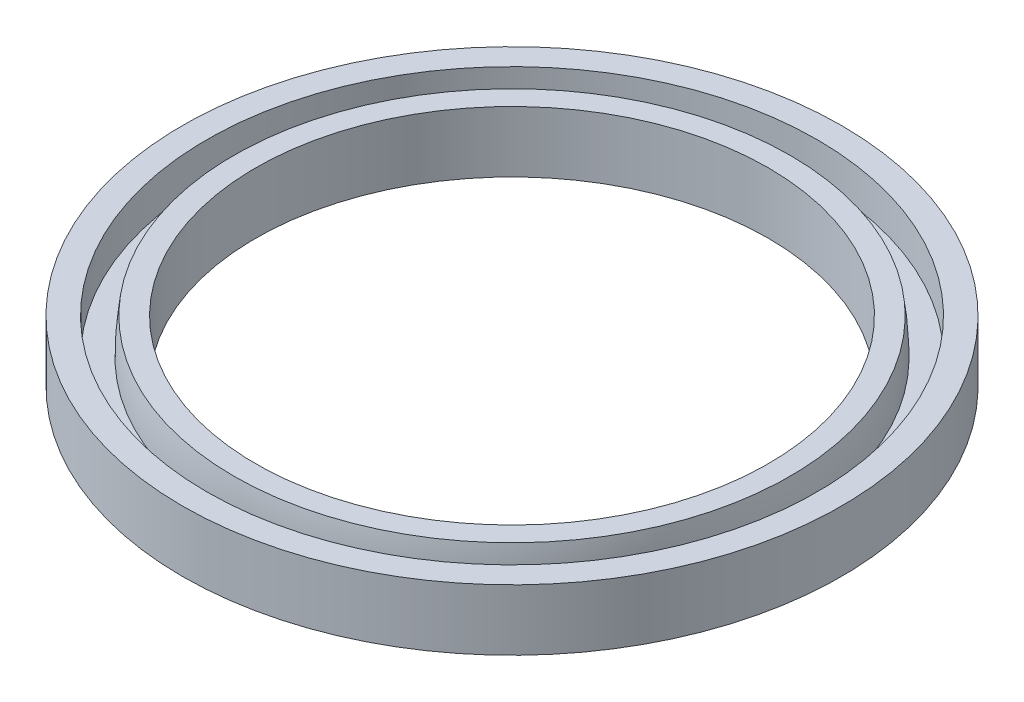
ISO-10303-21;
HEADER;
FILE_DESCRIPTION(('STEP AP214'),'2;1');
FILE_NAME('part.step','',(''),(''),'','','');
FILE_SCHEMA(('AUTOMOTIVE_DESIGN { 1 0 10303 214 1 1 1 1 }'));
ENDSEC;
DATA;
#1=APPLICATION_CONTEXT('core data for automotive mechanical design processes');
#2=APPLICATION_PROTOCOL_DEFINITION('international standard','automotive_design',2000,#1);
#3=PRODUCT_CONTEXT('',#1,'mechanical');
#4=PRODUCT('Part','Part','',(#3));
#5=PRODUCT_RELATED_PRODUCT_CATEGORY('part','',(#4));
#6=PRODUCT_DEFINITION_FORMATION('','',#4);
#7=PRODUCT_DEFINITION_CONTEXT('part definition',#1,'design');
#8=PRODUCT_DEFINITION('design','',#6,#7);
#9=PRODUCT_DEFINITION_SHAPE('','',#8);
#10=(LENGTH_UNIT() NAMED_UNIT(*) SI_UNIT(.MILLI.,.METRE.));
#11=(NAMED_UNIT(*) PLANE_ANGLE_UNIT() SI_UNIT($,.RADIAN.));
#12=(NAMED_UNIT(*) SI_UNIT($,.STERADIAN.) SOLID_ANGLE_UNIT());
#13=UNCERTAINTY_MEASURE_WITH_UNIT(LENGTH_MEASURE(1.E-05),#10,'distance_accuracy_value','');
#14=(GEOMETRIC_REPRESENTATION_CONTEXT(3) GLOBAL_UNCERTAINTY_ASSIGNED_CONTEXT((#13)) GLOBAL_UNIT_ASSIGNED_CONTEXT((#10,
#11,#12)) REPRESENTATION_CONTEXT('',''));
#15=CARTESIAN_POINT('',(0.,0.,0.));
#16=DIRECTION('',(0.,0.,1.));
#17=DIRECTION('',(1.,0.,0.));
#18=AXIS2_PLACEMENT_3D('',#15,#16,#17);
#19=CARTESIAN_POINT('',(0.,-564.589553779607,-1.93668275163386E-12));
#20=DIRECTION('',(0.,-1.,0.));
#21=DIRECTION('',(0.,0.,-1.));
#22=AXIS2_PLACEMENT_3D('',#19,#20,#21);
#23=CYLINDRICAL_SURFACE('',#22,21.);
#24=CARTESIAN_POINT('',(0.,-2.00000000000011,0.));
#25=DIRECTION('',(0.,-1.,0.));
#26=DIRECTION('',(0.,0.,-1.));
#27=AXIS2_PLACEMENT_3D('',#24,#25,#26);
#28=CIRCLE('',#27,21.);
#29=CARTESIAN_POINT('',(0.,-2.00000000000004,-21.));
#30=VERTEX_POINT('',#29);
#31=EDGE_CURVE('E62',#30,#30,#28,.T.);
#32=ORIENTED_EDGE('',*,*,#31,.T.);
#33=EDGE_LOOP('',(#32));
#34=FACE_BOUND('',#33,.T.);
#35=CARTESIAN_POINT('',(0.,2.99999999999989,0.));
#36=DIRECTION('',(0.,-1.,0.));
#37=DIRECTION('',(0.,0.,-1.));
#38=AXIS2_PLACEMENT_3D('',#35,#36,#37);
#39=CIRCLE('',#38,21.);
#40=CARTESIAN_POINT('',(0.,2.99999999999996,-21.));
#41=VERTEX_POINT('',#40);
#42=EDGE_CURVE('E10',#41,#41,#39,.T.);
#43=ORIENTED_EDGE('',*,*,#42,.F.);
#44=EDGE_LOOP('',(#43));
#45=FACE_BOUND('',#44,.T.);
#46=ADVANCED_FACE('F34',(#34,#45),#23,.F.);
#47=CARTESIAN_POINT('',(0.,3.,-21.));
#48=DIRECTION('',(0.,1.,0.));
#49=DIRECTION('',(0.,0.,1.));
#50=AXIS2_PLACEMENT_3D('',#47,#48,#49);
#51=PLANE('',#50);
#52=ORIENTED_EDGE('',*,*,#42,.T.);
#53=EDGE_LOOP('',(#52));
#54=FACE_BOUND('',#53,.T.);
#55=CARTESIAN_POINT('',(0.,2.99999999999989,0.));
#56=DIRECTION('',(0.,-1.,0.));
#57=DIRECTION('',(0.,0.,-1.));
#58=AXIS2_PLACEMENT_3D('',#55,#56,#57);
#59=CIRCLE('',#58,22.7785085019828);
#60=CARTESIAN_POINT('',(0.,2.99999999999997,-22.7785085019828));
#61=VERTEX_POINT('',#60);
#62=EDGE_CURVE('E40',#61,#61,#59,.T.);
#63=ORIENTED_EDGE('',*,*,#62,.F.);
#64=EDGE_LOOP('',(#63));
#65=FACE_BOUND('',#64,.T.);
#66=ADVANCED_FACE('F80',(#54,#65),#51,.T.);
#67=CARTESIAN_POINT('',(0.,-2.03309591384482E-12,0.));
#68=DIRECTION('',(0.,-1.,0.));
#69=DIRECTION('',(0.,0.,-1.));
#70=AXIS2_PLACEMENT_3D('',#67,#68,#69);
#71=DEGENERATE_TOROIDAL_SURFACE('',#70,2.57244732932912,20.4275526706709,.T.);
#72=ORIENTED_EDGE('',*,*,#62,.T.);
#73=EDGE_LOOP('',(#72));
#74=FACE_BOUND('',#73,.T.);
#75=CARTESIAN_POINT('',(0.,-1.11022302462516E-13,0.));
#76=DIRECTION('',(0.,-1.,0.));
#77=DIRECTION('',(0.,0.,-1.));
#78=AXIS2_PLACEMENT_3D('',#75,#76,#77);
#79=CIRCLE('',#78,23.);
#80=CARTESIAN_POINT('',(0.,0.,-23.));
#81=VERTEX_POINT('',#80);
#82=EDGE_CURVE('E44',#81,#81,#79,.T.);
#83=ORIENTED_EDGE('',*,*,#82,.F.);
#84=EDGE_LOOP('',(#83));
#85=FACE_BOUND('',#84,.T.);
#86=ADVANCED_FACE('F84',(#74,#85),#71,.T.);
#87=CARTESIAN_POINT('',(0.,0.,-23.));
#88=DIRECTION('',(0.,1.,0.));
#89=DIRECTION('',(0.,0.,1.));
#90=AXIS2_PLACEMENT_3D('',#87,#88,#89);
#91=PLANE('',#90);
#92=ORIENTED_EDGE('',*,*,#82,.T.);
#93=EDGE_LOOP('',(#92));
#94=FACE_BOUND('',#93,.T.);
#95=CARTESIAN_POINT('',(0.,-1.11022302462516E-13,0.));
#96=DIRECTION('',(0.,-1.,0.));
#97=DIRECTION('',(0.,0.,-1.));
#98=AXIS2_PLACEMENT_3D('',#95,#96,#97);
#99=CIRCLE('',#98,25.);
#100=CARTESIAN_POINT('',(0.,0.,-25.));
#101=VERTEX_POINT('',#100);
#102=EDGE_CURVE('E48',#101,#101,#99,.T.);
#103=ORIENTED_EDGE('',*,*,#102,.F.);
#104=EDGE_LOOP('',(#103));
#105=FACE_BOUND('',#104,.T.);
#106=ADVANCED_FACE('F88',(#94,#105),#91,.T.);
#107=CARTESIAN_POINT('',(0.,-564.589553779607,-1.93668275163386E-12));
#108=DIRECTION('',(0.,-1.,0.));
#109=DIRECTION('',(0.,0.,-1.));
#110=AXIS2_PLACEMENT_3D('',#107,#108,#109);
#111=CYLINDRICAL_SURFACE('',#110,25.);
#112=ORIENTED_EDGE('',*,*,#102,.T.);
#113=EDGE_LOOP('',(#112));
#114=FACE_BOUND('',#113,.T.);
#115=CARTESIAN_POINT('',(0.,2.99999999999989,0.));
#116=DIRECTION('',(0.,-1.,0.));
#117=DIRECTION('',(0.,0.,-1.));
#118=AXIS2_PLACEMENT_3D('',#115,#116,#117);
#119=CIRCLE('',#118,25.);
#120=CARTESIAN_POINT('',(0.,2.99999999999998,-25.));
#121=VERTEX_POINT('',#120);
#122=EDGE_CURVE('E53',#121,#121,#119,.T.);
#123=ORIENTED_EDGE('',*,*,#122,.F.);
#124=EDGE_LOOP('',(#123));
#125=FACE_BOUND('',#124,.T.);
#126=ADVANCED_FACE('F94',(#114,#125),#111,.F.);
#127=CARTESIAN_POINT('',(0.,3.,-25.));
#128=DIRECTION('',(0.,1.,0.));
#129=DIRECTION('',(0.,0.,1.));
#130=AXIS2_PLACEMENT_3D('',#127,#128,#129);
#131=PLANE('',#130);
#132=ORIENTED_EDGE('',*,*,#122,.T.);
#133=EDGE_LOOP('',(#132));
#134=FACE_BOUND('',#133,.T.);
#135=CARTESIAN_POINT('',(0.,2.99999999999989,0.));
#136=DIRECTION('',(0.,-1.,0.));
#137=DIRECTION('',(0.,0.,-1.));
#138=AXIS2_PLACEMENT_3D('',#135,#136,#137);
#139=CIRCLE('',#138,27.);
#140=CARTESIAN_POINT('',(0.,2.99999999999998,-27.));
#141=VERTEX_POINT('',#140);
#142=EDGE_CURVE('E56',#141,#141,#139,.T.);
#143=ORIENTED_EDGE('',*,*,#142,.F.);
#144=EDGE_LOOP('',(#143));
#145=FACE_BOUND('',#144,.T.);
#146=ADVANCED_FACE('F76',(#134,#145),#131,.T.);
#147=CARTESIAN_POINT('',(0.,-564.589553779607,-1.93668275163386E-12));
#148=DIRECTION('',(0.,-1.,0.));
#149=DIRECTION('',(0.,0.,-1.));
#150=AXIS2_PLACEMENT_3D('',#147,#148,#149);
#151=CYLINDRICAL_SURFACE('',#150,27.);
#152=ORIENTED_EDGE('',*,*,#142,.T.);
#153=EDGE_LOOP('',(#152));
#154=FACE_BOUND('',#153,.T.);
#155=CARTESIAN_POINT('',(0.,-2.00000000000011,0.));
#156=DIRECTION('',(0.,-1.,0.));
#157=DIRECTION('',(0.,0.,-1.));
#158=AXIS2_PLACEMENT_3D('',#155,#156,#157);
#159=CIRCLE('',#158,27.);
#160=CARTESIAN_POINT('',(0.,-2.00000000000002,-27.));
#161=VERTEX_POINT('',#160);
#162=EDGE_CURVE('E59',#161,#161,#159,.T.);
#163=ORIENTED_EDGE('',*,*,#162,.F.);
#164=EDGE_LOOP('',(#163));
#165=FACE_BOUND('',#164,.T.);
#166=ADVANCED_FACE('F70',(#154,#165),#151,.T.);
#167=CARTESIAN_POINT('',(0.,-2.00000000000001,-21.));
#168=DIRECTION('',(0.,-1.,0.));
#169=DIRECTION('',(0.,0.,-1.));
#170=AXIS2_PLACEMENT_3D('',#167,#168,#169);
#171=PLANE('',#170);
#172=ORIENTED_EDGE('',*,*,#162,.T.);
#173=EDGE_LOOP('',(#172));
#174=FACE_BOUND('',#173,.T.);
#175=ORIENTED_EDGE('',*,*,#31,.F.);
#176=EDGE_LOOP('',(#175));
#177=FACE_BOUND('',#176,.T.);
#178=ADVANCED_FACE('F68',(#174,#177),#171,.T.);
#179=CLOSED_SHELL('',(#46,#66,#86,#106,#126,#146,#166,#178));
#180=MANIFOLD_SOLID_BREP('B2',#179);
#181=ADVANCED_BREP_SHAPE_REPRESENTATION('',(#18,#180),#14);
#182=SHAPE_DEFINITION_REPRESENTATION(#9,#181);
ENDSEC;
END-ISO-10303-21;
